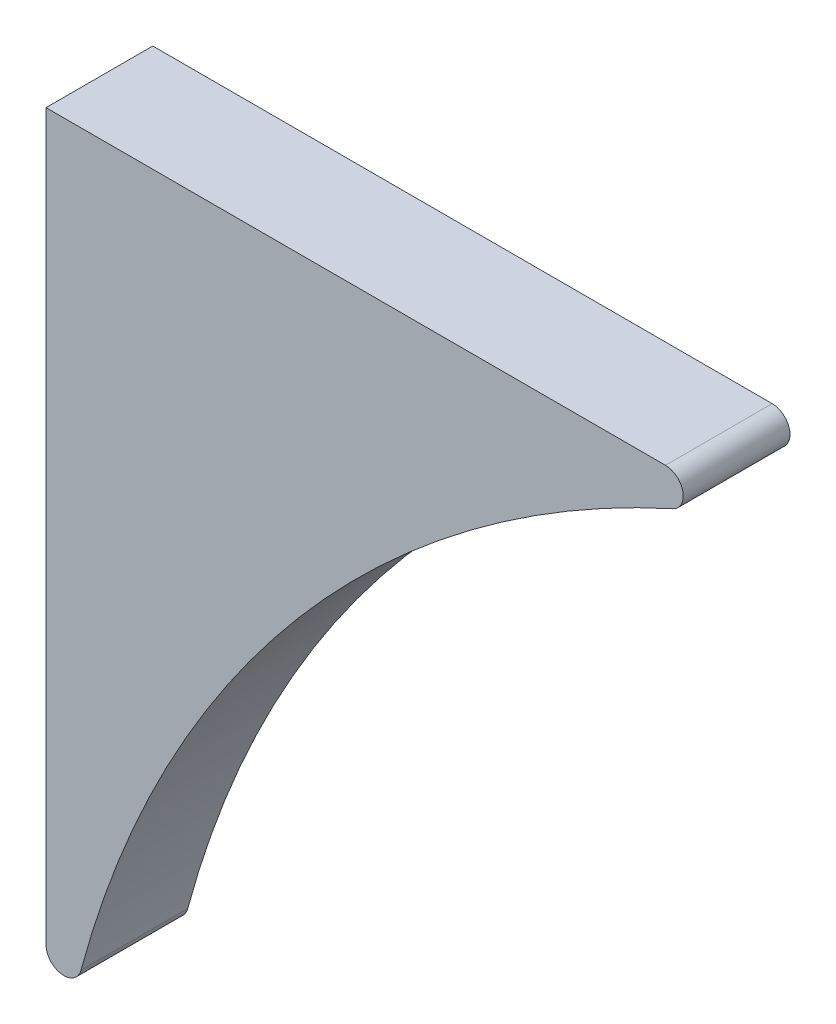
ISO-10303-21;
HEADER;
FILE_DESCRIPTION(('STEP AP214'),'2;1');
FILE_NAME('part.step','',(''),(''),'','','');
FILE_SCHEMA(('AUTOMOTIVE_DESIGN { 1 0 10303 214 1 1 1 1 }'));
ENDSEC;
DATA;
#1=APPLICATION_CONTEXT('core data for automotive mechanical design processes');
#2=APPLICATION_PROTOCOL_DEFINITION('international standard','automotive_design',2000,#1);
#3=PRODUCT_CONTEXT('',#1,'mechanical');
#4=PRODUCT('Part','Part','',(#3));
#5=PRODUCT_RELATED_PRODUCT_CATEGORY('part','',(#4));
#6=PRODUCT_DEFINITION_FORMATION('','',#4);
#7=PRODUCT_DEFINITION_CONTEXT('part definition',#1,'design');
#8=PRODUCT_DEFINITION('design','',#6,#7);
#9=PRODUCT_DEFINITION_SHAPE('','',#8);
#10=(LENGTH_UNIT() NAMED_UNIT(*) SI_UNIT(.MILLI.,.METRE.));
#11=(NAMED_UNIT(*) PLANE_ANGLE_UNIT() SI_UNIT($,.RADIAN.));
#12=(NAMED_UNIT(*) SI_UNIT($,.STERADIAN.) SOLID_ANGLE_UNIT());
#13=UNCERTAINTY_MEASURE_WITH_UNIT(LENGTH_MEASURE(1.E-05),#10,'distance_accuracy_value','');
#14=(GEOMETRIC_REPRESENTATION_CONTEXT(3) GLOBAL_UNCERTAINTY_ASSIGNED_CONTEXT((#13)) GLOBAL_UNIT_ASSIGNED_CONTEXT((#10,
#11,#12)) REPRESENTATION_CONTEXT('',''));
#15=CARTESIAN_POINT('',(0.,0.,0.));
#16=DIRECTION('',(0.,0.,1.));
#17=DIRECTION('',(1.,0.,0.));
#18=AXIS2_PLACEMENT_3D('',#15,#16,#17);
#19=CARTESIAN_POINT('',(40.,0.,3.));
#20=DIRECTION('',(0.,-1.,0.));
#21=DIRECTION('',(0.,0.,-1.));
#22=AXIS2_PLACEMENT_3D('',#19,#20,#21);
#23=PLANE('',#22);
#24=DIRECTION('',(-1.,0.,0.));
#25=VECTOR('',#24,1.);
#26=CARTESIAN_POINT('',(40.,0.,3.));
#27=LINE('',#26,#25);
#28=CARTESIAN_POINT('',(34.8166130176727,0.,3.));
#29=VERTEX_POINT('',#28);
#30=CARTESIAN_POINT('',(0.,0.,3.));
#31=VERTEX_POINT('',#30);
#32=EDGE_CURVE('E82',#29,#31,#27,.T.);
#33=ORIENTED_EDGE('',*,*,#32,.F.);
#34=DIRECTION('',(0.,0.,1.));
#35=VECTOR('',#34,1.);
#36=CARTESIAN_POINT('',(34.8166130176727,0.,3.));
#37=LINE('',#36,#35);
#38=CARTESIAN_POINT('',(34.8166130176727,0.,-3.));
#39=VERTEX_POINT('',#38);
#40=EDGE_CURVE('E11',#29,#39,#37,.F.);
#41=ORIENTED_EDGE('',*,*,#40,.T.);
#42=DIRECTION('',(-1.,0.,0.));
#43=VECTOR('',#42,1.);
#44=CARTESIAN_POINT('',(40.,0.,-3.));
#45=LINE('',#44,#43);
#46=CARTESIAN_POINT('',(0.,0.,-3.));
#47=VERTEX_POINT('',#46);
#48=EDGE_CURVE('E103',#39,#47,#45,.T.);
#49=ORIENTED_EDGE('',*,*,#48,.T.);
#50=DIRECTION('',(0.,0.,-1.));
#51=VECTOR('',#50,1.);
#52=CARTESIAN_POINT('',(0.,0.,3.));
#53=LINE('',#52,#51);
#54=EDGE_CURVE('E98',#31,#47,#53,.T.);
#55=ORIENTED_EDGE('',*,*,#54,.F.);
#56=EDGE_LOOP('',(#33,#41,#49,#55));
#57=FACE_BOUND('',#56,.T.);
#58=ADVANCED_FACE('F33',(#57),#23,.F.);
#59=CARTESIAN_POINT('',(0.,0.,3.));
#60=DIRECTION('',(1.,0.,0.));
#61=DIRECTION('',(0.,0.,-1.));
#62=AXIS2_PLACEMENT_3D('',#59,#60,#61);
#63=PLANE('',#62);
#64=DIRECTION('',(0.,-1.,0.));
#65=VECTOR('',#64,1.);
#66=CARTESIAN_POINT('',(0.,0.,-3.));
#67=LINE('',#66,#65);
#68=CARTESIAN_POINT('',(0.,-40.7484477612224,-3.));
#69=VERTEX_POINT('',#68);
#70=EDGE_CURVE('E91',#47,#69,#67,.T.);
#71=ORIENTED_EDGE('',*,*,#70,.T.);
#72=DIRECTION('',(0.,0.,1.));
#73=VECTOR('',#72,1.);
#74=CARTESIAN_POINT('',(0.,-40.7484477612224,3.));
#75=LINE('',#74,#73);
#76=CARTESIAN_POINT('',(0.,-40.7484477612224,3.));
#77=VERTEX_POINT('',#76);
#78=EDGE_CURVE('E100',#69,#77,#75,.T.);
#79=ORIENTED_EDGE('',*,*,#78,.T.);
#80=DIRECTION('',(0.,-1.,0.));
#81=VECTOR('',#80,1.);
#82=CARTESIAN_POINT('',(0.,0.,3.));
#83=LINE('',#82,#81);
#84=EDGE_CURVE('E85',#31,#77,#83,.T.);
#85=ORIENTED_EDGE('',*,*,#84,.F.);
#86=ORIENTED_EDGE('',*,*,#54,.T.);
#87=EDGE_LOOP('',(#71,#79,#85,#86));
#88=FACE_BOUND('',#87,.T.);
#89=ADVANCED_FACE('F97',(#88),#63,.F.);
#90=CARTESIAN_POINT('',(0.,0.,3.));
#91=DIRECTION('',(0.,0.,1.));
#92=DIRECTION('',(1.,0.,0.));
#93=AXIS2_PLACEMENT_3D('',#90,#91,#92);
#94=PLANE('',#93);
#95=ORIENTED_EDGE('',*,*,#84,.T.);
#96=CARTESIAN_POINT('',(1.,-40.7484477612224,3.));
#97=DIRECTION('',(0.,0.,1.));
#98=DIRECTION('',(1.,0.,0.));
#99=AXIS2_PLACEMENT_3D('',#96,#97,#98);
#100=CIRCLE('',#99,1.);
#101=CARTESIAN_POINT('',(1.96563492304378,-41.0083500417015,3.));
#102=VERTEX_POINT('',#101);
#103=EDGE_CURVE('E111',#77,#102,#100,.T.);
#104=ORIENTED_EDGE('',*,*,#103,.T.);
#105=CARTESIAN_POINT('',(59.9037303056706,-56.6024868704471,3.));
#106=DIRECTION('',(0.,0.,1.));
#107=DIRECTION('',(-1.,0.,0.));
#108=AXIS2_PLACEMENT_3D('',#105,#106,#107);
#109=CIRCLE('',#108,60.);
#110=CARTESIAN_POINT('',(35.2278772355087,-1.91151617820405,3.));
#111=VERTEX_POINT('',#110);
#112=EDGE_CURVE('E122',#111,#102,#109,.T.);
#113=ORIENTED_EDGE('',*,*,#112,.F.);
#114=CARTESIAN_POINT('',(34.8166130176727,-1.,3.));
#115=DIRECTION('',(0.,0.,1.));
#116=DIRECTION('',(1.,0.,0.));
#117=AXIS2_PLACEMENT_3D('',#114,#115,#116);
#118=CIRCLE('',#117,1.);
#119=EDGE_CURVE('E88',#111,#29,#118,.T.);
#120=ORIENTED_EDGE('',*,*,#119,.T.);
#121=ORIENTED_EDGE('',*,*,#32,.T.);
#122=EDGE_LOOP('',(#95,#104,#113,#120,#121));
#123=FACE_BOUND('',#122,.T.);
#124=ADVANCED_FACE('F84',(#123),#94,.T.);
#125=CARTESIAN_POINT('',(0.,0.,-3.));
#126=DIRECTION('',(0.,0.,1.));
#127=DIRECTION('',(1.,0.,0.));
#128=AXIS2_PLACEMENT_3D('',#125,#126,#127);
#129=PLANE('',#128);
#130=CARTESIAN_POINT('',(59.9037303056706,-56.6024868704471,-3.));
#131=DIRECTION('',(0.,0.,1.));
#132=DIRECTION('',(-1.,0.,0.));
#133=AXIS2_PLACEMENT_3D('',#130,#131,#132);
#134=CIRCLE('',#133,60.);
#135=CARTESIAN_POINT('',(35.2278772355087,-1.91151617820405,-3.));
#136=VERTEX_POINT('',#135);
#137=CARTESIAN_POINT('',(1.96563492304378,-41.0083500417015,-3.));
#138=VERTEX_POINT('',#137);
#139=EDGE_CURVE('E119',#136,#138,#134,.T.);
#140=ORIENTED_EDGE('',*,*,#139,.T.);
#141=CARTESIAN_POINT('',(1.,-40.7484477612224,-3.));
#142=DIRECTION('',(0.,0.,1.));
#143=DIRECTION('',(1.,0.,0.));
#144=AXIS2_PLACEMENT_3D('',#141,#142,#143);
#145=CIRCLE('',#144,1.);
#146=EDGE_CURVE('E41',#138,#69,#145,.F.);
#147=ORIENTED_EDGE('',*,*,#146,.T.);
#148=ORIENTED_EDGE('',*,*,#70,.F.);
#149=ORIENTED_EDGE('',*,*,#48,.F.);
#150=CARTESIAN_POINT('',(34.8166130176727,-1.,-3.));
#151=DIRECTION('',(0.,0.,1.));
#152=DIRECTION('',(1.,0.,0.));
#153=AXIS2_PLACEMENT_3D('',#150,#151,#152);
#154=CIRCLE('',#153,1.);
#155=EDGE_CURVE('E48',#39,#136,#154,.F.);
#156=ORIENTED_EDGE('',*,*,#155,.T.);
#157=EDGE_LOOP('',(#140,#147,#148,#149,#156));
#158=FACE_BOUND('',#157,.T.);
#159=ADVANCED_FACE('F118',(#158),#129,.F.);
#160=CARTESIAN_POINT('',(59.9037303056706,-56.6024868704471,-3.));
#161=DIRECTION('',(0.,0.,1.));
#162=DIRECTION('',(1.,0.,0.));
#163=AXIS2_PLACEMENT_3D('',#160,#161,#162);
#164=CYLINDRICAL_SURFACE('',#163,60.);
#165=ORIENTED_EDGE('',*,*,#112,.T.);
#166=DIRECTION('',(0.,0.,1.));
#167=VECTOR('',#166,1.);
#168=CARTESIAN_POINT('',(1.96563492304378,-41.0083500417015,-3.));
#169=LINE('',#168,#167);
#170=EDGE_CURVE('E55',#102,#138,#169,.F.);
#171=ORIENTED_EDGE('',*,*,#170,.T.);
#172=ORIENTED_EDGE('',*,*,#139,.F.);
#173=DIRECTION('',(0.,0.,1.));
#174=VECTOR('',#173,1.);
#175=CARTESIAN_POINT('',(35.2278772355087,-1.91151617820404,-3.));
#176=LINE('',#175,#174);
#177=EDGE_CURVE('E113',#136,#111,#176,.T.);
#178=ORIENTED_EDGE('',*,*,#177,.T.);
#179=EDGE_LOOP('',(#165,#171,#172,#178));
#180=FACE_BOUND('',#179,.T.);
#181=ADVANCED_FACE('F123',(#180),#164,.F.);
#182=CARTESIAN_POINT('',(1.,-40.7484477612224,-3.));
#183=DIRECTION('',(0.,0.,1.));
#184=DIRECTION('',(1.,0.,0.));
#185=AXIS2_PLACEMENT_3D('',#182,#183,#184);
#186=CYLINDRICAL_SURFACE('',#185,1.);
#187=ORIENTED_EDGE('',*,*,#146,.F.);
#188=ORIENTED_EDGE('',*,*,#170,.F.);
#189=ORIENTED_EDGE('',*,*,#103,.F.);
#190=ORIENTED_EDGE('',*,*,#78,.F.);
#191=EDGE_LOOP('',(#187,#188,#189,#190));
#192=FACE_BOUND('',#191,.T.);
#193=ADVANCED_FACE('F121',(#192),#186,.T.);
#194=CARTESIAN_POINT('',(34.8166130176727,-1.,-3.));
#195=DIRECTION('',(0.,0.,1.));
#196=DIRECTION('',(1.,0.,0.));
#197=AXIS2_PLACEMENT_3D('',#194,#195,#196);
#198=CYLINDRICAL_SURFACE('',#197,1.);
#199=ORIENTED_EDGE('',*,*,#119,.F.);
#200=ORIENTED_EDGE('',*,*,#177,.F.);
#201=ORIENTED_EDGE('',*,*,#155,.F.);
#202=ORIENTED_EDGE('',*,*,#40,.F.);
#203=EDGE_LOOP('',(#199,#200,#201,#202));
#204=FACE_BOUND('',#203,.T.);
#205=ADVANCED_FACE('F35',(#204),#198,.T.);
#206=CLOSED_SHELL('',(#58,#89,#124,#159,#181,#193,#205));
#207=MANIFOLD_SOLID_BREP('B2',#206);
#208=ADVANCED_BREP_SHAPE_REPRESENTATION('',(#18,#207),#14);
#209=SHAPE_DEFINITION_REPRESENTATION(#9,#208);
ENDSEC;
END-ISO-10303-21;
